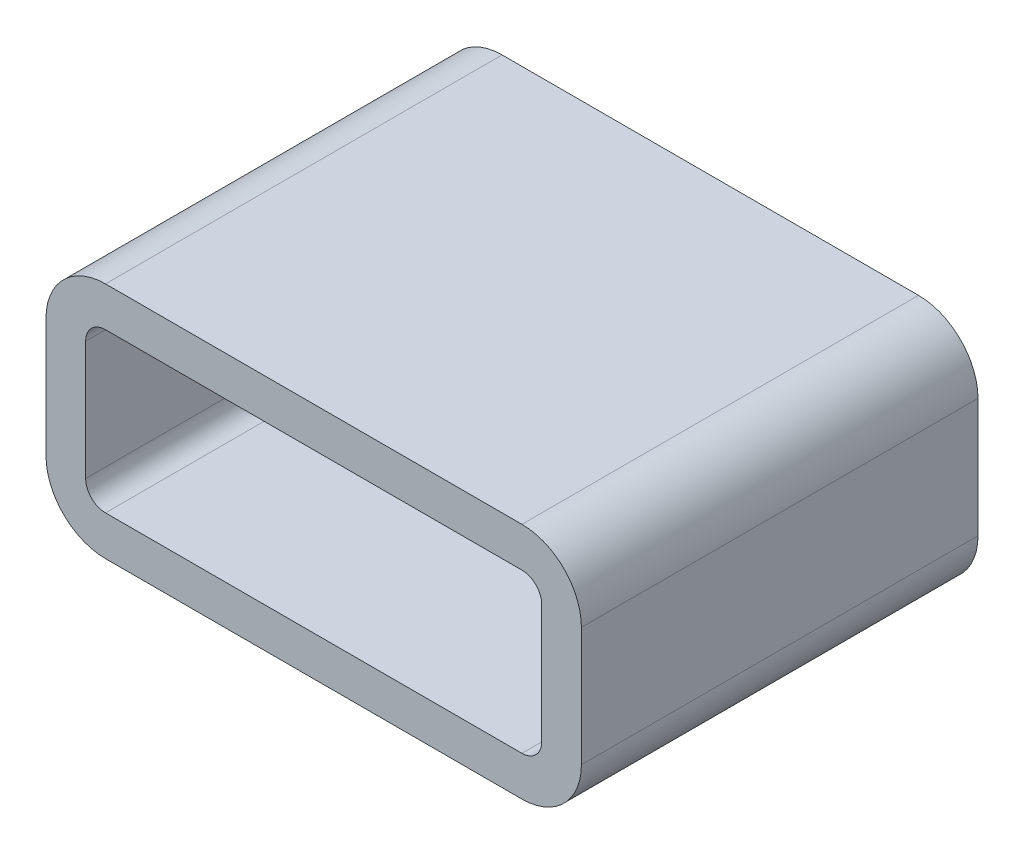
ISO-10303-21;
HEADER;
FILE_DESCRIPTION(('STEP AP214'),'2;1');
FILE_NAME('part.step','',(''),(''),'','','');
FILE_SCHEMA(('AUTOMOTIVE_DESIGN { 1 0 10303 214 1 1 1 1 }'));
ENDSEC;
DATA;
#1=APPLICATION_CONTEXT('core data for automotive mechanical design processes');
#2=APPLICATION_PROTOCOL_DEFINITION('international standard','automotive_design',2000,#1);
#3=PRODUCT_CONTEXT('',#1,'mechanical');
#4=PRODUCT('Part','Part','',(#3));
#5=PRODUCT_RELATED_PRODUCT_CATEGORY('part','',(#4));
#6=PRODUCT_DEFINITION_FORMATION('','',#4);
#7=PRODUCT_DEFINITION_CONTEXT('part definition',#1,'design');
#8=PRODUCT_DEFINITION('design','',#6,#7);
#9=PRODUCT_DEFINITION_SHAPE('','',#8);
#10=(LENGTH_UNIT() NAMED_UNIT(*) SI_UNIT(.MILLI.,.METRE.));
#11=(NAMED_UNIT(*) PLANE_ANGLE_UNIT() SI_UNIT($,.RADIAN.));
#12=(NAMED_UNIT(*) SI_UNIT($,.STERADIAN.) SOLID_ANGLE_UNIT());
#13=UNCERTAINTY_MEASURE_WITH_UNIT(LENGTH_MEASURE(1.E-05),#10,'distance_accuracy_value','');
#14=(GEOMETRIC_REPRESENTATION_CONTEXT(3) GLOBAL_UNCERTAINTY_ASSIGNED_CONTEXT((#13)) GLOBAL_UNIT_ASSIGNED_CONTEXT((#10,
#11,#12)) REPRESENTATION_CONTEXT('',''));
#15=CARTESIAN_POINT('',(0.,0.,0.));
#16=DIRECTION('',(0.,0.,1.));
#17=DIRECTION('',(1.,0.,0.));
#18=AXIS2_PLACEMENT_3D('',#15,#16,#17);
#19=CARTESIAN_POINT('',(-13.5,6.,20.));
#20=DIRECTION('',(0.,1.,0.));
#21=DIRECTION('',(0.,0.,1.));
#22=AXIS2_PLACEMENT_3D('',#19,#20,#21);
#23=PLANE('',#22);
#24=DIRECTION('',(1.,0.,0.));
#25=VECTOR('',#24,1.);
#26=CARTESIAN_POINT('',(-13.5,6.,0.));
#27=LINE('',#26,#25);
#28=CARTESIAN_POINT('',(-10.5,6.,0.));
#29=VERTEX_POINT('',#28);
#30=CARTESIAN_POINT('',(10.5,6.,0.));
#31=VERTEX_POINT('',#30);
#32=EDGE_CURVE('E151',#29,#31,#27,.T.);
#33=ORIENTED_EDGE('',*,*,#32,.F.);
#34=DIRECTION('',(0.,0.,-1.));
#35=VECTOR('',#34,1.);
#36=CARTESIAN_POINT('',(-10.5,6.,20.));
#37=LINE('',#36,#35);
#38=CARTESIAN_POINT('',(-10.5,6.,20.));
#39=VERTEX_POINT('',#38);
#40=EDGE_CURVE('E205',#29,#39,#37,.F.);
#41=ORIENTED_EDGE('',*,*,#40,.T.);
#42=DIRECTION('',(1.,0.,0.));
#43=VECTOR('',#42,1.);
#44=CARTESIAN_POINT('',(-13.5,6.,20.));
#45=LINE('',#44,#43);
#46=CARTESIAN_POINT('',(10.5,6.,20.));
#47=VERTEX_POINT('',#46);
#48=EDGE_CURVE('E272',#39,#47,#45,.T.);
#49=ORIENTED_EDGE('',*,*,#48,.T.);
#50=DIRECTION('',(0.,0.,-1.));
#51=VECTOR('',#50,1.);
#52=CARTESIAN_POINT('',(10.5,6.,20.));
#53=LINE('',#52,#51);
#54=EDGE_CURVE('E203',#47,#31,#53,.T.);
#55=ORIENTED_EDGE('',*,*,#54,.T.);
#56=EDGE_LOOP('',(#33,#41,#49,#55));
#57=FACE_BOUND('',#56,.T.);
#58=ADVANCED_FACE('F33',(#57),#23,.T.);
#59=CARTESIAN_POINT('',(-13.5,6.,20.));
#60=DIRECTION('',(1.,0.,0.));
#61=DIRECTION('',(0.,1.,0.));
#62=AXIS2_PLACEMENT_3D('',#59,#60,#61);
#63=PLANE('',#62);
#64=DIRECTION('',(0.,-1.,0.));
#65=VECTOR('',#64,1.);
#66=CARTESIAN_POINT('',(-13.5,6.,0.));
#67=LINE('',#66,#65);
#68=CARTESIAN_POINT('',(-13.5,3.,0.));
#69=VERTEX_POINT('',#68);
#70=CARTESIAN_POINT('',(-13.5,-3.,0.));
#71=VERTEX_POINT('',#70);
#72=EDGE_CURVE('E178',#69,#71,#67,.T.);
#73=ORIENTED_EDGE('',*,*,#72,.T.);
#74=DIRECTION('',(0.,0.,-1.));
#75=VECTOR('',#74,1.);
#76=CARTESIAN_POINT('',(-13.5,-3.,20.));
#77=LINE('',#76,#75);
#78=CARTESIAN_POINT('',(-13.5,-3.,20.));
#79=VERTEX_POINT('',#78);
#80=EDGE_CURVE('E201',#71,#79,#77,.F.);
#81=ORIENTED_EDGE('',*,*,#80,.T.);
#82=DIRECTION('',(0.,-1.,0.));
#83=VECTOR('',#82,1.);
#84=CARTESIAN_POINT('',(-13.5,6.,20.));
#85=LINE('',#84,#83);
#86=CARTESIAN_POINT('',(-13.5,3.,20.));
#87=VERTEX_POINT('',#86);
#88=EDGE_CURVE('E171',#87,#79,#85,.T.);
#89=ORIENTED_EDGE('',*,*,#88,.F.);
#90=DIRECTION('',(0.,0.,-1.));
#91=VECTOR('',#90,1.);
#92=CARTESIAN_POINT('',(-13.5,3.,0.));
#93=LINE('',#92,#91);
#94=EDGE_CURVE('E198',#87,#69,#93,.T.);
#95=ORIENTED_EDGE('',*,*,#94,.T.);
#96=EDGE_LOOP('',(#73,#81,#89,#95));
#97=FACE_BOUND('',#96,.T.);
#98=ADVANCED_FACE('F287',(#97),#63,.F.);
#99=CARTESIAN_POINT('',(-13.5,-6.,20.));
#100=DIRECTION('',(0.,1.,0.));
#101=DIRECTION('',(0.,0.,1.));
#102=AXIS2_PLACEMENT_3D('',#99,#100,#101);
#103=PLANE('',#102);
#104=DIRECTION('',(1.,0.,0.));
#105=VECTOR('',#104,1.);
#106=CARTESIAN_POINT('',(-13.5,-6.,0.));
#107=LINE('',#106,#105);
#108=CARTESIAN_POINT('',(-10.5,-6.,0.));
#109=VERTEX_POINT('',#108);
#110=CARTESIAN_POINT('',(10.5,-6.,0.));
#111=VERTEX_POINT('',#110);
#112=EDGE_CURVE('E166',#109,#111,#107,.T.);
#113=ORIENTED_EDGE('',*,*,#112,.T.);
#114=DIRECTION('',(0.,0.,-1.));
#115=VECTOR('',#114,1.);
#116=CARTESIAN_POINT('',(10.5,-6.,20.));
#117=LINE('',#116,#115);
#118=CARTESIAN_POINT('',(10.5,-6.,20.));
#119=VERTEX_POINT('',#118);
#120=EDGE_CURVE('E189',#111,#119,#117,.F.);
#121=ORIENTED_EDGE('',*,*,#120,.T.);
#122=DIRECTION('',(1.,0.,0.));
#123=VECTOR('',#122,1.);
#124=CARTESIAN_POINT('',(-13.5,-6.,20.));
#125=LINE('',#124,#123);
#126=CARTESIAN_POINT('',(-10.5,-6.,20.));
#127=VERTEX_POINT('',#126);
#128=EDGE_CURVE('E175',#127,#119,#125,.T.);
#129=ORIENTED_EDGE('',*,*,#128,.F.);
#130=DIRECTION('',(0.,0.,-1.));
#131=VECTOR('',#130,1.);
#132=CARTESIAN_POINT('',(-10.5,-6.,20.));
#133=LINE('',#132,#131);
#134=EDGE_CURVE('E186',#127,#109,#133,.T.);
#135=ORIENTED_EDGE('',*,*,#134,.T.);
#136=EDGE_LOOP('',(#113,#121,#129,#135));
#137=FACE_BOUND('',#136,.T.);
#138=ADVANCED_FACE('F296',(#137),#103,.F.);
#139=CARTESIAN_POINT('',(13.5,6.,20.));
#140=DIRECTION('',(1.,0.,0.));
#141=DIRECTION('',(0.,1.,0.));
#142=AXIS2_PLACEMENT_3D('',#139,#140,#141);
#143=PLANE('',#142);
#144=DIRECTION('',(0.,-1.,0.));
#145=VECTOR('',#144,1.);
#146=CARTESIAN_POINT('',(13.5,6.,20.));
#147=LINE('',#146,#145);
#148=CARTESIAN_POINT('',(13.5,3.,20.));
#149=VERTEX_POINT('',#148);
#150=CARTESIAN_POINT('',(13.5,-3.,20.));
#151=VERTEX_POINT('',#150);
#152=EDGE_CURVE('E275',#149,#151,#147,.T.);
#153=ORIENTED_EDGE('',*,*,#152,.T.);
#154=DIRECTION('',(0.,0.,-1.));
#155=VECTOR('',#154,1.);
#156=CARTESIAN_POINT('',(13.5,-3.,0.));
#157=LINE('',#156,#155);
#158=CARTESIAN_POINT('',(13.5,-3.,0.));
#159=VERTEX_POINT('',#158);
#160=EDGE_CURVE('E157',#151,#159,#157,.T.);
#161=ORIENTED_EDGE('',*,*,#160,.T.);
#162=DIRECTION('',(0.,-1.,0.));
#163=VECTOR('',#162,1.);
#164=CARTESIAN_POINT('',(13.5,6.,0.));
#165=LINE('',#164,#163);
#166=CARTESIAN_POINT('',(13.5,3.,0.));
#167=VERTEX_POINT('',#166);
#168=EDGE_CURVE('E149',#167,#159,#165,.T.);
#169=ORIENTED_EDGE('',*,*,#168,.F.);
#170=DIRECTION('',(0.,0.,-1.));
#171=VECTOR('',#170,1.);
#172=CARTESIAN_POINT('',(13.5,3.,20.));
#173=LINE('',#172,#171);
#174=EDGE_CURVE('E163',#167,#149,#173,.F.);
#175=ORIENTED_EDGE('',*,*,#174,.T.);
#176=EDGE_LOOP('',(#153,#161,#169,#175));
#177=FACE_BOUND('',#176,.T.);
#178=ADVANCED_FACE('F162',(#177),#143,.T.);
#179=CARTESIAN_POINT('',(0.,0.,20.));
#180=DIRECTION('',(0.,0.,-1.));
#181=DIRECTION('',(-1.,0.,0.));
#182=AXIS2_PLACEMENT_3D('',#179,#180,#181);
#183=PLANE('',#182);
#184=DIRECTION('',(-1.,0.,0.));
#185=VECTOR('',#184,1.);
#186=CARTESIAN_POINT('',(11.5,4.,20.));
#187=LINE('',#186,#185);
#188=CARTESIAN_POINT('',(10.5,4.,20.));
#189=VERTEX_POINT('',#188);
#190=CARTESIAN_POINT('',(-10.5,4.,20.));
#191=VERTEX_POINT('',#190);
#192=EDGE_CURVE('E243',#189,#191,#187,.T.);
#193=ORIENTED_EDGE('',*,*,#192,.F.);
#194=CARTESIAN_POINT('',(10.5,3.,20.));
#195=DIRECTION('',(0.,0.,-1.));
#196=DIRECTION('',(-1.,0.,0.));
#197=AXIS2_PLACEMENT_3D('',#194,#195,#196);
#198=CIRCLE('',#197,1.);
#199=CARTESIAN_POINT('',(11.5,3.,20.));
#200=VERTEX_POINT('',#199);
#201=EDGE_CURVE('E226',#189,#200,#198,.T.);
#202=ORIENTED_EDGE('',*,*,#201,.T.);
#203=DIRECTION('',(0.,1.,0.));
#204=VECTOR('',#203,1.);
#205=CARTESIAN_POINT('',(11.5,-4.,20.));
#206=LINE('',#205,#204);
#207=CARTESIAN_POINT('',(11.5,-3.,20.));
#208=VERTEX_POINT('',#207);
#209=EDGE_CURVE('E252',#208,#200,#206,.T.);
#210=ORIENTED_EDGE('',*,*,#209,.F.);
#211=CARTESIAN_POINT('',(10.5,-3.,20.));
#212=DIRECTION('',(0.,0.,-1.));
#213=DIRECTION('',(-1.,0.,0.));
#214=AXIS2_PLACEMENT_3D('',#211,#212,#213);
#215=CIRCLE('',#214,1.);
#216=CARTESIAN_POINT('',(10.5,-4.,20.));
#217=VERTEX_POINT('',#216);
#218=EDGE_CURVE('E230',#208,#217,#215,.T.);
#219=ORIENTED_EDGE('',*,*,#218,.T.);
#220=DIRECTION('',(1.,0.,0.));
#221=VECTOR('',#220,1.);
#222=CARTESIAN_POINT('',(-11.5,-4.,20.));
#223=LINE('',#222,#221);
#224=CARTESIAN_POINT('',(-10.5,-4.,20.));
#225=VERTEX_POINT('',#224);
#226=EDGE_CURVE('E269',#225,#217,#223,.T.);
#227=ORIENTED_EDGE('',*,*,#226,.F.);
#228=CARTESIAN_POINT('',(-10.5,-3.,20.));
#229=DIRECTION('',(0.,0.,-1.));
#230=DIRECTION('',(-1.,0.,0.));
#231=AXIS2_PLACEMENT_3D('',#228,#229,#230);
#232=CIRCLE('',#231,1.);
#233=CARTESIAN_POINT('',(-11.5,-3.,20.));
#234=VERTEX_POINT('',#233);
#235=EDGE_CURVE('E234',#225,#234,#232,.T.);
#236=ORIENTED_EDGE('',*,*,#235,.T.);
#237=DIRECTION('',(0.,-1.,0.));
#238=VECTOR('',#237,1.);
#239=CARTESIAN_POINT('',(-11.5,4.,20.));
#240=LINE('',#239,#238);
#241=CARTESIAN_POINT('',(-11.5,3.,20.));
#242=VERTEX_POINT('',#241);
#243=EDGE_CURVE('E244',#242,#234,#240,.T.);
#244=ORIENTED_EDGE('',*,*,#243,.F.);
#245=CARTESIAN_POINT('',(-10.5,3.,20.));
#246=DIRECTION('',(0.,0.,-1.));
#247=DIRECTION('',(-1.,0.,0.));
#248=AXIS2_PLACEMENT_3D('',#245,#246,#247);
#249=CIRCLE('',#248,1.);
#250=EDGE_CURVE('E41',#242,#191,#249,.T.);
#251=ORIENTED_EDGE('',*,*,#250,.T.);
#252=EDGE_LOOP('',(#193,#202,#210,#219,#227,#236,#244,#251));
#253=FACE_BOUND('',#252,.T.);
#254=ORIENTED_EDGE('',*,*,#128,.T.);
#255=CARTESIAN_POINT('',(10.5,-3.,20.));
#256=DIRECTION('',(0.,0.,-1.));
#257=DIRECTION('',(-1.,0.,0.));
#258=AXIS2_PLACEMENT_3D('',#255,#256,#257);
#259=CIRCLE('',#258,3.);
#260=EDGE_CURVE('E196',#119,#151,#259,.F.);
#261=ORIENTED_EDGE('',*,*,#260,.T.);
#262=ORIENTED_EDGE('',*,*,#152,.F.);
#263=CARTESIAN_POINT('',(10.5,3.,20.));
#264=DIRECTION('',(0.,0.,-1.));
#265=DIRECTION('',(-1.,0.,0.));
#266=AXIS2_PLACEMENT_3D('',#263,#264,#265);
#267=CIRCLE('',#266,3.);
#268=EDGE_CURVE('E170',#149,#47,#267,.F.);
#269=ORIENTED_EDGE('',*,*,#268,.T.);
#270=ORIENTED_EDGE('',*,*,#48,.F.);
#271=CARTESIAN_POINT('',(-10.5,3.,20.));
#272=DIRECTION('',(0.,0.,-1.));
#273=DIRECTION('',(-1.,0.,0.));
#274=AXIS2_PLACEMENT_3D('',#271,#272,#273);
#275=CIRCLE('',#274,3.);
#276=EDGE_CURVE('E192',#39,#87,#275,.F.);
#277=ORIENTED_EDGE('',*,*,#276,.T.);
#278=ORIENTED_EDGE('',*,*,#88,.T.);
#279=CARTESIAN_POINT('',(-10.5,-3.,20.));
#280=DIRECTION('',(0.,0.,-1.));
#281=DIRECTION('',(-1.,0.,0.));
#282=AXIS2_PLACEMENT_3D('',#279,#280,#281);
#283=CIRCLE('',#282,3.);
#284=EDGE_CURVE('E194',#79,#127,#283,.F.);
#285=ORIENTED_EDGE('',*,*,#284,.T.);
#286=EDGE_LOOP('',(#254,#261,#262,#269,#270,#277,#278,#285));
#287=FACE_BOUND('',#286,.T.);
#288=ADVANCED_FACE('F241',(#253,#287),#183,.F.);
#289=CARTESIAN_POINT('',(0.,0.,0.));
#290=DIRECTION('',(0.,0.,-1.));
#291=DIRECTION('',(-1.,0.,0.));
#292=AXIS2_PLACEMENT_3D('',#289,#290,#291);
#293=PLANE('',#292);
#294=DIRECTION('',(1.,0.,0.));
#295=VECTOR('',#294,1.);
#296=CARTESIAN_POINT('',(-11.5,-4.,0.));
#297=LINE('',#296,#295);
#298=CARTESIAN_POINT('',(-10.5,-4.,0.));
#299=VERTEX_POINT('',#298);
#300=CARTESIAN_POINT('',(10.5,-4.,0.));
#301=VERTEX_POINT('',#300);
#302=EDGE_CURVE('E257',#299,#301,#297,.T.);
#303=ORIENTED_EDGE('',*,*,#302,.T.);
#304=CARTESIAN_POINT('',(10.5,-3.,0.));
#305=DIRECTION('',(0.,0.,-1.));
#306=DIRECTION('',(-1.,0.,0.));
#307=AXIS2_PLACEMENT_3D('',#304,#305,#306);
#308=CIRCLE('',#307,1.);
#309=CARTESIAN_POINT('',(11.5,-3.,0.));
#310=VERTEX_POINT('',#309);
#311=EDGE_CURVE('E232',#301,#310,#308,.F.);
#312=ORIENTED_EDGE('',*,*,#311,.T.);
#313=DIRECTION('',(0.,1.,0.));
#314=VECTOR('',#313,1.);
#315=CARTESIAN_POINT('',(11.5,-4.,0.));
#316=LINE('',#315,#314);
#317=CARTESIAN_POINT('',(11.5,3.,0.));
#318=VERTEX_POINT('',#317);
#319=EDGE_CURVE('E262',#310,#318,#316,.T.);
#320=ORIENTED_EDGE('',*,*,#319,.T.);
#321=CARTESIAN_POINT('',(10.5,3.,0.));
#322=DIRECTION('',(0.,0.,-1.));
#323=DIRECTION('',(-1.,0.,0.));
#324=AXIS2_PLACEMENT_3D('',#321,#322,#323);
#325=CIRCLE('',#324,1.);
#326=CARTESIAN_POINT('',(10.5,4.,0.));
#327=VERTEX_POINT('',#326);
#328=EDGE_CURVE('E228',#318,#327,#325,.F.);
#329=ORIENTED_EDGE('',*,*,#328,.T.);
#330=DIRECTION('',(-1.,0.,0.));
#331=VECTOR('',#330,1.);
#332=CARTESIAN_POINT('',(11.5,4.,0.));
#333=LINE('',#332,#331);
#334=CARTESIAN_POINT('',(-10.5,4.,0.));
#335=VERTEX_POINT('',#334);
#336=EDGE_CURVE('E258',#327,#335,#333,.T.);
#337=ORIENTED_EDGE('',*,*,#336,.T.);
#338=CARTESIAN_POINT('',(-10.5,3.,0.));
#339=DIRECTION('',(0.,0.,-1.));
#340=DIRECTION('',(-1.,0.,0.));
#341=AXIS2_PLACEMENT_3D('',#338,#339,#340);
#342=CIRCLE('',#341,1.);
#343=CARTESIAN_POINT('',(-11.5,3.,0.));
#344=VERTEX_POINT('',#343);
#345=EDGE_CURVE('E11',#335,#344,#342,.F.);
#346=ORIENTED_EDGE('',*,*,#345,.T.);
#347=DIRECTION('',(0.,-1.,0.));
#348=VECTOR('',#347,1.);
#349=CARTESIAN_POINT('',(-11.5,4.,0.));
#350=LINE('',#349,#348);
#351=CARTESIAN_POINT('',(-11.5,-3.,0.));
#352=VERTEX_POINT('',#351);
#353=EDGE_CURVE('E255',#344,#352,#350,.T.);
#354=ORIENTED_EDGE('',*,*,#353,.T.);
#355=CARTESIAN_POINT('',(-10.5,-3.,0.));
#356=DIRECTION('',(0.,0.,-1.));
#357=DIRECTION('',(-1.,0.,0.));
#358=AXIS2_PLACEMENT_3D('',#355,#356,#357);
#359=CIRCLE('',#358,1.);
#360=EDGE_CURVE('E236',#352,#299,#359,.F.);
#361=ORIENTED_EDGE('',*,*,#360,.T.);
#362=EDGE_LOOP('',(#303,#312,#320,#329,#337,#346,#354,#361));
#363=FACE_BOUND('',#362,.T.);
#364=ORIENTED_EDGE('',*,*,#168,.T.);
#365=CARTESIAN_POINT('',(10.5,-3.,0.));
#366=DIRECTION('',(0.,0.,-1.));
#367=DIRECTION('',(-1.,0.,0.));
#368=AXIS2_PLACEMENT_3D('',#365,#366,#367);
#369=CIRCLE('',#368,3.);
#370=EDGE_CURVE('E184',#159,#111,#369,.T.);
#371=ORIENTED_EDGE('',*,*,#370,.T.);
#372=ORIENTED_EDGE('',*,*,#112,.F.);
#373=CARTESIAN_POINT('',(-10.5,-3.,0.));
#374=DIRECTION('',(0.,0.,-1.));
#375=DIRECTION('',(-1.,0.,0.));
#376=AXIS2_PLACEMENT_3D('',#373,#374,#375);
#377=CIRCLE('',#376,3.);
#378=EDGE_CURVE('E182',#109,#71,#377,.T.);
#379=ORIENTED_EDGE('',*,*,#378,.T.);
#380=ORIENTED_EDGE('',*,*,#72,.F.);
#381=CARTESIAN_POINT('',(-10.5,3.,0.));
#382=DIRECTION('',(0.,0.,-1.));
#383=DIRECTION('',(-1.,0.,0.));
#384=AXIS2_PLACEMENT_3D('',#381,#382,#383);
#385=CIRCLE('',#384,3.);
#386=EDGE_CURVE('E156',#69,#29,#385,.T.);
#387=ORIENTED_EDGE('',*,*,#386,.T.);
#388=ORIENTED_EDGE('',*,*,#32,.T.);
#389=CARTESIAN_POINT('',(10.5,3.,0.));
#390=DIRECTION('',(0.,0.,-1.));
#391=DIRECTION('',(-1.,0.,0.));
#392=AXIS2_PLACEMENT_3D('',#389,#390,#391);
#393=CIRCLE('',#392,3.);
#394=EDGE_CURVE('E146',#31,#167,#393,.T.);
#395=ORIENTED_EDGE('',*,*,#394,.T.);
#396=EDGE_LOOP('',(#364,#371,#372,#379,#380,#387,#388,#395));
#397=FACE_BOUND('',#396,.T.);
#398=ADVANCED_FACE('F148',(#363,#397),#293,.T.);
#399=CARTESIAN_POINT('',(11.5,-4.,0.));
#400=DIRECTION('',(1.,0.,0.));
#401=DIRECTION('',(0.,1.,0.));
#402=AXIS2_PLACEMENT_3D('',#399,#400,#401);
#403=PLANE('',#402);
#404=ORIENTED_EDGE('',*,*,#209,.T.);
#405=DIRECTION('',(0.,0.,1.));
#406=VECTOR('',#405,1.);
#407=CARTESIAN_POINT('',(11.5,3.,0.));
#408=LINE('',#407,#406);
#409=EDGE_CURVE('E215',#200,#318,#408,.F.);
#410=ORIENTED_EDGE('',*,*,#409,.T.);
#411=ORIENTED_EDGE('',*,*,#319,.F.);
#412=DIRECTION('',(0.,0.,1.));
#413=VECTOR('',#412,1.);
#414=CARTESIAN_POINT('',(11.5,-3.,20.));
#415=LINE('',#414,#413);
#416=EDGE_CURVE('E212',#310,#208,#415,.T.);
#417=ORIENTED_EDGE('',*,*,#416,.T.);
#418=EDGE_LOOP('',(#404,#410,#411,#417));
#419=FACE_BOUND('',#418,.T.);
#420=ADVANCED_FACE('F335',(#419),#403,.F.);
#421=CARTESIAN_POINT('',(-11.5,-4.,0.));
#422=DIRECTION('',(0.,-1.,0.));
#423=DIRECTION('',(0.,0.,-1.));
#424=AXIS2_PLACEMENT_3D('',#421,#422,#423);
#425=PLANE('',#424);
#426=ORIENTED_EDGE('',*,*,#226,.T.);
#427=DIRECTION('',(0.,0.,1.));
#428=VECTOR('',#427,1.);
#429=CARTESIAN_POINT('',(10.5,-4.,0.));
#430=LINE('',#429,#428);
#431=EDGE_CURVE('E220',#217,#301,#430,.F.);
#432=ORIENTED_EDGE('',*,*,#431,.T.);
#433=ORIENTED_EDGE('',*,*,#302,.F.);
#434=DIRECTION('',(0.,0.,1.));
#435=VECTOR('',#434,1.);
#436=CARTESIAN_POINT('',(-10.5,-4.,20.));
#437=LINE('',#436,#435);
#438=EDGE_CURVE('E217',#299,#225,#437,.T.);
#439=ORIENTED_EDGE('',*,*,#438,.T.);
#440=EDGE_LOOP('',(#426,#432,#433,#439));
#441=FACE_BOUND('',#440,.T.);
#442=ADVANCED_FACE('F331',(#441),#425,.F.);
#443=CARTESIAN_POINT('',(-11.5,4.,0.));
#444=DIRECTION('',(-1.,0.,0.));
#445=DIRECTION('',(0.,-1.,0.));
#446=AXIS2_PLACEMENT_3D('',#443,#444,#445);
#447=PLANE('',#446);
#448=ORIENTED_EDGE('',*,*,#243,.T.);
#449=DIRECTION('',(0.,0.,1.));
#450=VECTOR('',#449,1.);
#451=CARTESIAN_POINT('',(-11.5,-3.,0.));
#452=LINE('',#451,#450);
#453=EDGE_CURVE('E48',#234,#352,#452,.F.);
#454=ORIENTED_EDGE('',*,*,#453,.T.);
#455=ORIENTED_EDGE('',*,*,#353,.F.);
#456=DIRECTION('',(0.,0.,1.));
#457=VECTOR('',#456,1.);
#458=CARTESIAN_POINT('',(-11.5,3.,20.));
#459=LINE('',#458,#457);
#460=EDGE_CURVE('E222',#344,#242,#459,.T.);
#461=ORIENTED_EDGE('',*,*,#460,.T.);
#462=EDGE_LOOP('',(#448,#454,#455,#461));
#463=FACE_BOUND('',#462,.T.);
#464=ADVANCED_FACE('F254',(#463),#447,.F.);
#465=CARTESIAN_POINT('',(11.5,4.,0.));
#466=DIRECTION('',(0.,1.,0.));
#467=DIRECTION('',(0.,0.,1.));
#468=AXIS2_PLACEMENT_3D('',#465,#466,#467);
#469=PLANE('',#468);
#470=ORIENTED_EDGE('',*,*,#336,.F.);
#471=DIRECTION('',(0.,0.,1.));
#472=VECTOR('',#471,1.);
#473=CARTESIAN_POINT('',(10.5,4.,20.));
#474=LINE('',#473,#472);
#475=EDGE_CURVE('E209',#327,#189,#474,.T.);
#476=ORIENTED_EDGE('',*,*,#475,.T.);
#477=ORIENTED_EDGE('',*,*,#192,.T.);
#478=DIRECTION('',(0.,0.,1.));
#479=VECTOR('',#478,1.);
#480=CARTESIAN_POINT('',(-10.5,4.,0.));
#481=LINE('',#480,#479);
#482=EDGE_CURVE('E207',#191,#335,#481,.F.);
#483=ORIENTED_EDGE('',*,*,#482,.T.);
#484=EDGE_LOOP('',(#470,#476,#477,#483));
#485=FACE_BOUND('',#484,.T.);
#486=ADVANCED_FACE('F250',(#485),#469,.F.);
#487=CARTESIAN_POINT('',(10.5,-3.,20.));
#488=DIRECTION('',(0.,0.,1.));
#489=DIRECTION('',(1.,0.,0.));
#490=AXIS2_PLACEMENT_3D('',#487,#488,#489);
#491=CYLINDRICAL_SURFACE('',#490,3.);
#492=ORIENTED_EDGE('',*,*,#260,.F.);
#493=ORIENTED_EDGE('',*,*,#120,.F.);
#494=ORIENTED_EDGE('',*,*,#370,.F.);
#495=ORIENTED_EDGE('',*,*,#160,.F.);
#496=EDGE_LOOP('',(#492,#493,#494,#495));
#497=FACE_BOUND('',#496,.T.);
#498=ADVANCED_FACE('F298',(#497),#491,.T.);
#499=CARTESIAN_POINT('',(-10.5,-3.,20.));
#500=DIRECTION('',(0.,0.,-1.));
#501=DIRECTION('',(-1.,0.,0.));
#502=AXIS2_PLACEMENT_3D('',#499,#500,#501);
#503=CYLINDRICAL_SURFACE('',#502,3.);
#504=ORIENTED_EDGE('',*,*,#284,.F.);
#505=ORIENTED_EDGE('',*,*,#80,.F.);
#506=ORIENTED_EDGE('',*,*,#378,.F.);
#507=ORIENTED_EDGE('',*,*,#134,.F.);
#508=EDGE_LOOP('',(#504,#505,#506,#507));
#509=FACE_BOUND('',#508,.T.);
#510=ADVANCED_FACE('F292',(#509),#503,.T.);
#511=CARTESIAN_POINT('',(-10.5,3.,20.));
#512=DIRECTION('',(0.,0.,1.));
#513=DIRECTION('',(1.,0.,0.));
#514=AXIS2_PLACEMENT_3D('',#511,#512,#513);
#515=CYLINDRICAL_SURFACE('',#514,3.);
#516=ORIENTED_EDGE('',*,*,#276,.F.);
#517=ORIENTED_EDGE('',*,*,#40,.F.);
#518=ORIENTED_EDGE('',*,*,#386,.F.);
#519=ORIENTED_EDGE('',*,*,#94,.F.);
#520=EDGE_LOOP('',(#516,#517,#518,#519));
#521=FACE_BOUND('',#520,.T.);
#522=ADVANCED_FACE('F304',(#521),#515,.T.);
#523=CARTESIAN_POINT('',(10.5,3.,20.));
#524=DIRECTION('',(0.,0.,-1.));
#525=DIRECTION('',(-1.,0.,0.));
#526=AXIS2_PLACEMENT_3D('',#523,#524,#525);
#527=CYLINDRICAL_SURFACE('',#526,3.);
#528=ORIENTED_EDGE('',*,*,#268,.F.);
#529=ORIENTED_EDGE('',*,*,#174,.F.);
#530=ORIENTED_EDGE('',*,*,#394,.F.);
#531=ORIENTED_EDGE('',*,*,#54,.F.);
#532=EDGE_LOOP('',(#528,#529,#530,#531));
#533=FACE_BOUND('',#532,.T.);
#534=ADVANCED_FACE('F169',(#533),#527,.T.);
#535=CARTESIAN_POINT('',(10.5,3.,0.));
#536=DIRECTION('',(0.,0.,-1.));
#537=DIRECTION('',(-1.,0.,0.));
#538=AXIS2_PLACEMENT_3D('',#535,#536,#537);
#539=CYLINDRICAL_SURFACE('',#538,1.);
#540=ORIENTED_EDGE('',*,*,#328,.F.);
#541=ORIENTED_EDGE('',*,*,#409,.F.);
#542=ORIENTED_EDGE('',*,*,#201,.F.);
#543=ORIENTED_EDGE('',*,*,#475,.F.);
#544=EDGE_LOOP('',(#540,#541,#542,#543));
#545=FACE_BOUND('',#544,.T.);
#546=ADVANCED_FACE('F311',(#545),#539,.F.);
#547=CARTESIAN_POINT('',(10.5,-3.,0.));
#548=DIRECTION('',(0.,0.,-1.));
#549=DIRECTION('',(-1.,0.,0.));
#550=AXIS2_PLACEMENT_3D('',#547,#548,#549);
#551=CYLINDRICAL_SURFACE('',#550,1.);
#552=ORIENTED_EDGE('',*,*,#311,.F.);
#553=ORIENTED_EDGE('',*,*,#431,.F.);
#554=ORIENTED_EDGE('',*,*,#218,.F.);
#555=ORIENTED_EDGE('',*,*,#416,.F.);
#556=EDGE_LOOP('',(#552,#553,#554,#555));
#557=FACE_BOUND('',#556,.T.);
#558=ADVANCED_FACE('F385',(#557),#551,.F.);
#559=CARTESIAN_POINT('',(-10.5,-3.,0.));
#560=DIRECTION('',(0.,0.,-1.));
#561=DIRECTION('',(-1.,0.,0.));
#562=AXIS2_PLACEMENT_3D('',#559,#560,#561);
#563=CYLINDRICAL_SURFACE('',#562,1.);
#564=ORIENTED_EDGE('',*,*,#360,.F.);
#565=ORIENTED_EDGE('',*,*,#453,.F.);
#566=ORIENTED_EDGE('',*,*,#235,.F.);
#567=ORIENTED_EDGE('',*,*,#438,.F.);
#568=EDGE_LOOP('',(#564,#565,#566,#567));
#569=FACE_BOUND('',#568,.T.);
#570=ADVANCED_FACE('F396',(#569),#563,.F.);
#571=CARTESIAN_POINT('',(-10.5,3.,0.));
#572=DIRECTION('',(0.,0.,-1.));
#573=DIRECTION('',(-1.,0.,0.));
#574=AXIS2_PLACEMENT_3D('',#571,#572,#573);
#575=CYLINDRICAL_SURFACE('',#574,1.);
#576=ORIENTED_EDGE('',*,*,#345,.F.);
#577=ORIENTED_EDGE('',*,*,#482,.F.);
#578=ORIENTED_EDGE('',*,*,#250,.F.);
#579=ORIENTED_EDGE('',*,*,#460,.F.);
#580=EDGE_LOOP('',(#576,#577,#578,#579));
#581=FACE_BOUND('',#580,.T.);
#582=ADVANCED_FACE('F35',(#581),#575,.F.);
#583=CLOSED_SHELL('',(#58,#98,#138,#178,#288,#398,#420,#442,#464,#486,#498,#510,#522,#534,#546,
#558,#570,#582));
#584=MANIFOLD_SOLID_BREP('B2',#583);
#585=ADVANCED_BREP_SHAPE_REPRESENTATION('',(#18,#584),#14);
#586=SHAPE_DEFINITION_REPRESENTATION(#9,#585);
ENDSEC;
END-ISO-10303-21;
